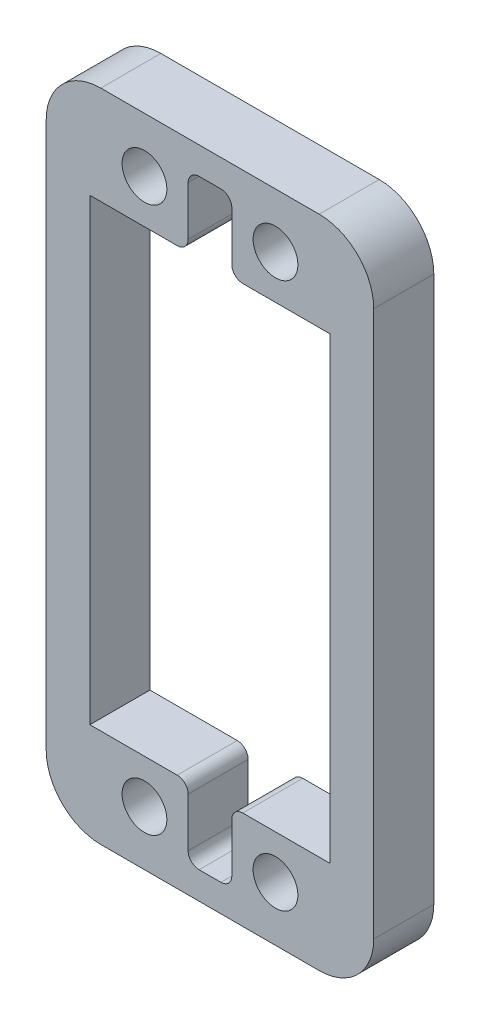
ISO-10303-21;
HEADER;
FILE_DESCRIPTION(('STEP AP214'),'2;1');
FILE_NAME('part.step','',(''),(''),'','','');
FILE_SCHEMA(('AUTOMOTIVE_DESIGN { 1 0 10303 214 1 1 1 1 }'));
ENDSEC;
DATA;
#1=APPLICATION_CONTEXT('core data for automotive mechanical design processes');
#2=APPLICATION_PROTOCOL_DEFINITION('international standard','automotive_design',2000,#1);
#3=PRODUCT_CONTEXT('',#1,'mechanical');
#4=PRODUCT('Part','Part','',(#3));
#5=PRODUCT_RELATED_PRODUCT_CATEGORY('part','',(#4));
#6=PRODUCT_DEFINITION_FORMATION('','',#4);
#7=PRODUCT_DEFINITION_CONTEXT('part definition',#1,'design');
#8=PRODUCT_DEFINITION('design','',#6,#7);
#9=PRODUCT_DEFINITION_SHAPE('','',#8);
#10=(LENGTH_UNIT() NAMED_UNIT(*) SI_UNIT(.MILLI.,.METRE.));
#11=(NAMED_UNIT(*) PLANE_ANGLE_UNIT() SI_UNIT($,.RADIAN.));
#12=(NAMED_UNIT(*) SI_UNIT($,.STERADIAN.) SOLID_ANGLE_UNIT());
#13=UNCERTAINTY_MEASURE_WITH_UNIT(LENGTH_MEASURE(1.E-05),#10,'distance_accuracy_value','');
#14=(GEOMETRIC_REPRESENTATION_CONTEXT(3) GLOBAL_UNCERTAINTY_ASSIGNED_CONTEXT((#13)) GLOBAL_UNIT_ASSIGNED_CONTEXT((#10,
#11,#12)) REPRESENTATION_CONTEXT('',''));
#15=CARTESIAN_POINT('',(0.,0.,0.));
#16=DIRECTION('',(0.,0.,1.));
#17=DIRECTION('',(1.,0.,0.));
#18=AXIS2_PLACEMENT_3D('',#15,#16,#17);
#19=CARTESIAN_POINT('',(11.,21.,5.5));
#20=DIRECTION('',(0.,1.,0.));
#21=DIRECTION('',(0.,0.,1.));
#22=AXIS2_PLACEMENT_3D('',#19,#20,#21);
#23=PLANE('',#22);
#24=DIRECTION('',(1.,0.,0.));
#25=VECTOR('',#24,1.);
#26=CARTESIAN_POINT('',(11.,21.,0.));
#27=LINE('',#26,#25);
#28=CARTESIAN_POINT('',(-11.,21.,0.));
#29=VERTEX_POINT('',#28);
#30=CARTESIAN_POINT('',(-3.,21.,0.));
#31=VERTEX_POINT('',#30);
#32=EDGE_CURVE('E251',#29,#31,#27,.T.);
#33=ORIENTED_EDGE('',*,*,#32,.T.);
#34=DIRECTION('',(0.,0.,1.));
#35=VECTOR('',#34,1.);
#36=CARTESIAN_POINT('',(-3.,21.,5.5));
#37=LINE('',#36,#35);
#38=CARTESIAN_POINT('',(-3.,21.,5.5));
#39=VERTEX_POINT('',#38);
#40=EDGE_CURVE('E387',#31,#39,#37,.T.);
#41=ORIENTED_EDGE('',*,*,#40,.T.);
#42=DIRECTION('',(1.,0.,0.));
#43=VECTOR('',#42,1.);
#44=CARTESIAN_POINT('',(11.,21.,5.5));
#45=LINE('',#44,#43);
#46=CARTESIAN_POINT('',(-11.,21.,5.5));
#47=VERTEX_POINT('',#46);
#48=EDGE_CURVE('E235',#47,#39,#45,.T.);
#49=ORIENTED_EDGE('',*,*,#48,.F.);
#50=DIRECTION('',(0.,0.,-1.));
#51=VECTOR('',#50,1.);
#52=CARTESIAN_POINT('',(-11.,21.,5.5));
#53=LINE('',#52,#51);
#54=EDGE_CURVE('E275',#47,#29,#53,.T.);
#55=ORIENTED_EDGE('',*,*,#54,.T.);
#56=EDGE_LOOP('',(#33,#41,#49,#55));
#57=FACE_BOUND('',#56,.T.);
#58=ADVANCED_FACE('F38',(#57),#23,.F.);
#59=CARTESIAN_POINT('',(-11.,-21.,5.5));
#60=DIRECTION('',(0.,-1.,0.));
#61=DIRECTION('',(0.,0.,-1.));
#62=AXIS2_PLACEMENT_3D('',#59,#60,#61);
#63=PLANE('',#62);
#64=DIRECTION('',(-1.,0.,0.));
#65=VECTOR('',#64,1.);
#66=CARTESIAN_POINT('',(-11.,-21.,5.5));
#67=LINE('',#66,#65);
#68=CARTESIAN_POINT('',(-3.00000000000001,-21.,5.5));
#69=VERTEX_POINT('',#68);
#70=CARTESIAN_POINT('',(-11.,-21.,5.5));
#71=VERTEX_POINT('',#70);
#72=EDGE_CURVE('E243',#69,#71,#67,.T.);
#73=ORIENTED_EDGE('',*,*,#72,.F.);
#74=DIRECTION('',(0.,0.,-1.));
#75=VECTOR('',#74,1.);
#76=CARTESIAN_POINT('',(-3.00000000000001,-21.,5.5));
#77=LINE('',#76,#75);
#78=CARTESIAN_POINT('',(-3.00000000000001,-21.,0.));
#79=VERTEX_POINT('',#78);
#80=EDGE_CURVE('E348',#69,#79,#77,.T.);
#81=ORIENTED_EDGE('',*,*,#80,.T.);
#82=DIRECTION('',(-1.,0.,0.));
#83=VECTOR('',#82,1.);
#84=CARTESIAN_POINT('',(-11.,-21.,0.));
#85=LINE('',#84,#83);
#86=CARTESIAN_POINT('',(-11.,-21.,0.));
#87=VERTEX_POINT('',#86);
#88=EDGE_CURVE('E265',#79,#87,#85,.T.);
#89=ORIENTED_EDGE('',*,*,#88,.T.);
#90=DIRECTION('',(0.,0.,-1.));
#91=VECTOR('',#90,1.);
#92=CARTESIAN_POINT('',(-11.,-21.,5.5));
#93=LINE('',#92,#91);
#94=EDGE_CURVE('E234',#71,#87,#93,.T.);
#95=ORIENTED_EDGE('',*,*,#94,.F.);
#96=EDGE_LOOP('',(#73,#81,#89,#95));
#97=FACE_BOUND('',#96,.T.);
#98=ADVANCED_FACE('F514',(#97),#63,.F.);
#99=CARTESIAN_POINT('',(-15.,-30.,5.5));
#100=DIRECTION('',(1.,0.,0.));
#101=DIRECTION('',(0.,0.,-1.));
#102=AXIS2_PLACEMENT_3D('',#99,#100,#101);
#103=PLANE('',#102);
#104=DIRECTION('',(0.,-1.,0.));
#105=VECTOR('',#104,1.);
#106=CARTESIAN_POINT('',(-15.,-30.,0.));
#107=LINE('',#106,#105);
#108=CARTESIAN_POINT('',(-15.,25.,0.));
#109=VERTEX_POINT('',#108);
#110=CARTESIAN_POINT('',(-15.,-25.,0.));
#111=VERTEX_POINT('',#110);
#112=EDGE_CURVE('E274',#109,#111,#107,.T.);
#113=ORIENTED_EDGE('',*,*,#112,.T.);
#114=DIRECTION('',(0.,0.,-1.));
#115=VECTOR('',#114,1.);
#116=CARTESIAN_POINT('',(-15.,-25.,5.5));
#117=LINE('',#116,#115);
#118=CARTESIAN_POINT('',(-15.,-25.,5.5));
#119=VERTEX_POINT('',#118);
#120=EDGE_CURVE('E318',#111,#119,#117,.F.);
#121=ORIENTED_EDGE('',*,*,#120,.T.);
#122=DIRECTION('',(0.,-1.,0.));
#123=VECTOR('',#122,1.);
#124=CARTESIAN_POINT('',(-15.,-30.,5.5));
#125=LINE('',#124,#123);
#126=CARTESIAN_POINT('',(-15.,25.,5.5));
#127=VERTEX_POINT('',#126);
#128=EDGE_CURVE('E279',#127,#119,#125,.T.);
#129=ORIENTED_EDGE('',*,*,#128,.F.);
#130=DIRECTION('',(0.,0.,-1.));
#131=VECTOR('',#130,1.);
#132=CARTESIAN_POINT('',(-15.,25.,5.5));
#133=LINE('',#132,#131);
#134=EDGE_CURVE('E315',#127,#109,#133,.T.);
#135=ORIENTED_EDGE('',*,*,#134,.T.);
#136=EDGE_LOOP('',(#113,#121,#129,#135));
#137=FACE_BOUND('',#136,.T.);
#138=ADVANCED_FACE('F496',(#137),#103,.F.);
#139=CARTESIAN_POINT('',(15.,-30.,5.5));
#140=DIRECTION('',(0.,1.,0.));
#141=DIRECTION('',(0.,0.,1.));
#142=AXIS2_PLACEMENT_3D('',#139,#140,#141);
#143=PLANE('',#142);
#144=DIRECTION('',(1.,0.,0.));
#145=VECTOR('',#144,1.);
#146=CARTESIAN_POINT('',(15.,-30.,5.5));
#147=LINE('',#146,#145);
#148=CARTESIAN_POINT('',(-10.,-30.,5.5));
#149=VERTEX_POINT('',#148);
#150=CARTESIAN_POINT('',(10.,-30.,5.5));
#151=VERTEX_POINT('',#150);
#152=EDGE_CURVE('E282',#149,#151,#147,.T.);
#153=ORIENTED_EDGE('',*,*,#152,.F.);
#154=DIRECTION('',(0.,0.,-1.));
#155=VECTOR('',#154,1.);
#156=CARTESIAN_POINT('',(-10.,-30.,5.5));
#157=LINE('',#156,#155);
#158=CARTESIAN_POINT('',(-10.,-30.,0.));
#159=VERTEX_POINT('',#158);
#160=EDGE_CURVE('E304',#149,#159,#157,.T.);
#161=ORIENTED_EDGE('',*,*,#160,.T.);
#162=DIRECTION('',(1.,0.,0.));
#163=VECTOR('',#162,1.);
#164=CARTESIAN_POINT('',(15.,-30.,0.));
#165=LINE('',#164,#163);
#166=CARTESIAN_POINT('',(10.,-30.,0.));
#167=VERTEX_POINT('',#166);
#168=EDGE_CURVE('E295',#159,#167,#165,.T.);
#169=ORIENTED_EDGE('',*,*,#168,.T.);
#170=DIRECTION('',(0.,0.,-1.));
#171=VECTOR('',#170,1.);
#172=CARTESIAN_POINT('',(10.,-30.,5.5));
#173=LINE('',#172,#171);
#174=EDGE_CURVE('E292',#167,#151,#173,.F.);
#175=ORIENTED_EDGE('',*,*,#174,.T.);
#176=EDGE_LOOP('',(#153,#161,#169,#175));
#177=FACE_BOUND('',#176,.T.);
#178=ADVANCED_FACE('F469',(#177),#143,.F.);
#179=CARTESIAN_POINT('',(15.,30.,5.5));
#180=DIRECTION('',(-1.,0.,0.));
#181=DIRECTION('',(0.,-1.,0.));
#182=AXIS2_PLACEMENT_3D('',#179,#180,#181);
#183=PLANE('',#182);
#184=DIRECTION('',(0.,1.,0.));
#185=VECTOR('',#184,1.);
#186=CARTESIAN_POINT('',(15.,30.,5.5));
#187=LINE('',#186,#185);
#188=CARTESIAN_POINT('',(15.,-25.,5.5));
#189=VERTEX_POINT('',#188);
#190=CARTESIAN_POINT('',(15.,25.,5.5));
#191=VERTEX_POINT('',#190);
#192=EDGE_CURVE('E286',#189,#191,#187,.T.);
#193=ORIENTED_EDGE('',*,*,#192,.F.);
#194=DIRECTION('',(0.,0.,-1.));
#195=VECTOR('',#194,1.);
#196=CARTESIAN_POINT('',(15.,-25.,5.5));
#197=LINE('',#196,#195);
#198=CARTESIAN_POINT('',(15.,-25.,0.));
#199=VERTEX_POINT('',#198);
#200=EDGE_CURVE('E330',#189,#199,#197,.T.);
#201=ORIENTED_EDGE('',*,*,#200,.T.);
#202=DIRECTION('',(0.,1.,0.));
#203=VECTOR('',#202,1.);
#204=CARTESIAN_POINT('',(15.,30.,0.));
#205=LINE('',#204,#203);
#206=CARTESIAN_POINT('',(15.,25.,0.));
#207=VERTEX_POINT('',#206);
#208=EDGE_CURVE('E298',#199,#207,#205,.T.);
#209=ORIENTED_EDGE('',*,*,#208,.T.);
#210=DIRECTION('',(0.,0.,-1.));
#211=VECTOR('',#210,1.);
#212=CARTESIAN_POINT('',(15.,25.,5.5));
#213=LINE('',#212,#211);
#214=EDGE_CURVE('E328',#207,#191,#213,.F.);
#215=ORIENTED_EDGE('',*,*,#214,.T.);
#216=EDGE_LOOP('',(#193,#201,#209,#215));
#217=FACE_BOUND('',#216,.T.);
#218=ADVANCED_FACE('F479',(#217),#183,.F.);
#219=CARTESIAN_POINT('',(-15.,30.,5.5));
#220=DIRECTION('',(0.,-1.,0.));
#221=DIRECTION('',(0.,0.,-1.));
#222=AXIS2_PLACEMENT_3D('',#219,#220,#221);
#223=PLANE('',#222);
#224=DIRECTION('',(-1.,0.,0.));
#225=VECTOR('',#224,1.);
#226=CARTESIAN_POINT('',(-15.,30.,5.5));
#227=LINE('',#226,#225);
#228=CARTESIAN_POINT('',(9.99999999999999,30.,5.5));
#229=VERTEX_POINT('',#228);
#230=CARTESIAN_POINT('',(-10.,30.,5.5));
#231=VERTEX_POINT('',#230);
#232=EDGE_CURVE('E289',#229,#231,#227,.T.);
#233=ORIENTED_EDGE('',*,*,#232,.F.);
#234=DIRECTION('',(0.,0.,-1.));
#235=VECTOR('',#234,1.);
#236=CARTESIAN_POINT('',(10.,30.,5.5));
#237=LINE('',#236,#235);
#238=CARTESIAN_POINT('',(9.99999999999999,30.,0.));
#239=VERTEX_POINT('',#238);
#240=EDGE_CURVE('E335',#229,#239,#237,.T.);
#241=ORIENTED_EDGE('',*,*,#240,.T.);
#242=DIRECTION('',(-1.,0.,0.));
#243=VECTOR('',#242,1.);
#244=CARTESIAN_POINT('',(-15.,30.,0.));
#245=LINE('',#244,#243);
#246=CARTESIAN_POINT('',(-10.,30.,0.));
#247=VERTEX_POINT('',#246);
#248=EDGE_CURVE('E283',#239,#247,#245,.T.);
#249=ORIENTED_EDGE('',*,*,#248,.T.);
#250=DIRECTION('',(0.,0.,-1.));
#251=VECTOR('',#250,1.);
#252=CARTESIAN_POINT('',(-10.,30.,5.5));
#253=LINE('',#252,#251);
#254=EDGE_CURVE('E333',#247,#231,#253,.F.);
#255=ORIENTED_EDGE('',*,*,#254,.T.);
#256=EDGE_LOOP('',(#233,#241,#249,#255));
#257=FACE_BOUND('',#256,.T.);
#258=ADVANCED_FACE('F487',(#257),#223,.F.);
#259=CARTESIAN_POINT('',(0.,0.,5.5));
#260=DIRECTION('',(0.,0.,-1.));
#261=DIRECTION('',(-1.,0.,0.));
#262=AXIS2_PLACEMENT_3D('',#259,#260,#261);
#263=PLANE('',#262);
#264=CARTESIAN_POINT('',(-6.,25.,5.5));
#265=DIRECTION('',(0.,0.,-1.));
#266=DIRECTION('',(-1.,0.,0.));
#267=AXIS2_PLACEMENT_3D('',#264,#265,#266);
#268=CIRCLE('',#267,2.05);
#269=CARTESIAN_POINT('',(-8.05,25.,5.5));
#270=VERTEX_POINT('',#269);
#271=EDGE_CURVE('E444',#270,#270,#268,.T.);
#272=ORIENTED_EDGE('',*,*,#271,.T.);
#273=EDGE_LOOP('',(#272));
#274=FACE_BOUND('',#273,.T.);
#275=CARTESIAN_POINT('',(6.,-25.,5.5));
#276=DIRECTION('',(0.,0.,-1.));
#277=DIRECTION('',(-1.,0.,0.));
#278=AXIS2_PLACEMENT_3D('',#275,#276,#277);
#279=CIRCLE('',#278,2.05);
#280=CARTESIAN_POINT('',(3.95,-25.,5.5));
#281=VERTEX_POINT('',#280);
#282=EDGE_CURVE('E450',#281,#281,#279,.T.);
#283=ORIENTED_EDGE('',*,*,#282,.T.);
#284=EDGE_LOOP('',(#283));
#285=FACE_BOUND('',#284,.T.);
#286=CARTESIAN_POINT('',(-6.,-25.,5.5));
#287=DIRECTION('',(0.,0.,-1.));
#288=DIRECTION('',(-1.,0.,0.));
#289=AXIS2_PLACEMENT_3D('',#286,#287,#288);
#290=CIRCLE('',#289,2.05);
#291=CARTESIAN_POINT('',(-8.05,-25.,5.5));
#292=VERTEX_POINT('',#291);
#293=EDGE_CURVE('E848',#292,#292,#290,.T.);
#294=ORIENTED_EDGE('',*,*,#293,.T.);
#295=EDGE_LOOP('',(#294));
#296=FACE_BOUND('',#295,.T.);
#297=DIRECTION('',(0.,1.,0.));
#298=VECTOR('',#297,1.);
#299=CARTESIAN_POINT('',(-2.,27.5,5.5));
#300=LINE('',#299,#298);
#301=CARTESIAN_POINT('',(-2.00000000000001,-26.5,5.5));
#302=VERTEX_POINT('',#301);
#303=CARTESIAN_POINT('',(-2.00000000000001,-22.,5.5));
#304=VERTEX_POINT('',#303);
#305=EDGE_CURVE('E434',#302,#304,#300,.T.);
#306=ORIENTED_EDGE('',*,*,#305,.T.);
#307=CARTESIAN_POINT('',(-3.00000000000001,-22.,5.5));
#308=DIRECTION('',(0.,0.,-1.));
#309=DIRECTION('',(-1.,0.,0.));
#310=AXIS2_PLACEMENT_3D('',#307,#308,#309);
#311=CIRCLE('',#310,1.);
#312=EDGE_CURVE('E364',#304,#69,#311,.F.);
#313=ORIENTED_EDGE('',*,*,#312,.T.);
#314=ORIENTED_EDGE('',*,*,#72,.T.);
#315=DIRECTION('',(0.,1.,0.));
#316=VECTOR('',#315,1.);
#317=CARTESIAN_POINT('',(-11.,21.,5.5));
#318=LINE('',#317,#316);
#319=EDGE_CURVE('E242',#71,#47,#318,.T.);
#320=ORIENTED_EDGE('',*,*,#319,.T.);
#321=ORIENTED_EDGE('',*,*,#48,.T.);
#322=CARTESIAN_POINT('',(-3.,22.,5.5));
#323=DIRECTION('',(0.,0.,-1.));
#324=DIRECTION('',(-1.,0.,0.));
#325=AXIS2_PLACEMENT_3D('',#322,#323,#324);
#326=CIRCLE('',#325,1.);
#327=CARTESIAN_POINT('',(-2.,22.,5.5));
#328=VERTEX_POINT('',#327);
#329=EDGE_CURVE('E359',#39,#328,#326,.F.);
#330=ORIENTED_EDGE('',*,*,#329,.T.);
#331=CARTESIAN_POINT('',(-2.,26.5,5.5));
#332=VERTEX_POINT('',#331);
#333=EDGE_CURVE('E428',#328,#332,#300,.T.);
#334=ORIENTED_EDGE('',*,*,#333,.T.);
#335=CARTESIAN_POINT('',(-1.,26.5,5.5));
#336=DIRECTION('',(0.,0.,-1.));
#337=DIRECTION('',(-1.,0.,0.));
#338=AXIS2_PLACEMENT_3D('',#335,#336,#337);
#339=CIRCLE('',#338,1.);
#340=CARTESIAN_POINT('',(-1.,27.5,5.5));
#341=VERTEX_POINT('',#340);
#342=EDGE_CURVE('E11',#332,#341,#339,.T.);
#343=ORIENTED_EDGE('',*,*,#342,.T.);
#344=DIRECTION('',(1.,0.,0.));
#345=VECTOR('',#344,1.);
#346=CARTESIAN_POINT('',(2.,27.5,5.5));
#347=LINE('',#346,#345);
#348=CARTESIAN_POINT('',(1.,27.5,5.5));
#349=VERTEX_POINT('',#348);
#350=EDGE_CURVE('E426',#341,#349,#347,.T.);
#351=ORIENTED_EDGE('',*,*,#350,.T.);
#352=CARTESIAN_POINT('',(1.,26.5,5.5));
#353=DIRECTION('',(0.,0.,-1.));
#354=DIRECTION('',(-1.,0.,0.));
#355=AXIS2_PLACEMENT_3D('',#352,#353,#354);
#356=CIRCLE('',#355,1.);
#357=CARTESIAN_POINT('',(2.,26.5,5.5));
#358=VERTEX_POINT('',#357);
#359=EDGE_CURVE('E400',#349,#358,#356,.T.);
#360=ORIENTED_EDGE('',*,*,#359,.T.);
#361=DIRECTION('',(0.,-1.,0.));
#362=VECTOR('',#361,1.);
#363=CARTESIAN_POINT('',(2.,21.,5.5));
#364=LINE('',#363,#362);
#365=CARTESIAN_POINT('',(2.,22.,5.5));
#366=VERTEX_POINT('',#365);
#367=EDGE_CURVE('E432',#358,#366,#364,.T.);
#368=ORIENTED_EDGE('',*,*,#367,.T.);
#369=CARTESIAN_POINT('',(3.,22.,5.5));
#370=DIRECTION('',(0.,0.,-1.));
#371=DIRECTION('',(-1.,0.,0.));
#372=AXIS2_PLACEMENT_3D('',#369,#370,#371);
#373=CIRCLE('',#372,1.);
#374=CARTESIAN_POINT('',(3.,21.,5.5));
#375=VERTEX_POINT('',#374);
#376=EDGE_CURVE('E361',#366,#375,#373,.F.);
#377=ORIENTED_EDGE('',*,*,#376,.T.);
#378=CARTESIAN_POINT('',(11.,21.,5.5));
#379=VERTEX_POINT('',#378);
#380=EDGE_CURVE('E249',#375,#379,#45,.T.);
#381=ORIENTED_EDGE('',*,*,#380,.T.);
#382=DIRECTION('',(0.,-1.,0.));
#383=VECTOR('',#382,1.);
#384=CARTESIAN_POINT('',(11.,-21.,5.5));
#385=LINE('',#384,#383);
#386=CARTESIAN_POINT('',(11.,-21.,5.5));
#387=VERTEX_POINT('',#386);
#388=EDGE_CURVE('E228',#379,#387,#385,.T.);
#389=ORIENTED_EDGE('',*,*,#388,.T.);
#390=CARTESIAN_POINT('',(2.99999999999999,-21.,5.5));
#391=VERTEX_POINT('',#390);
#392=EDGE_CURVE('E238',#387,#391,#67,.T.);
#393=ORIENTED_EDGE('',*,*,#392,.T.);
#394=CARTESIAN_POINT('',(2.99999999999999,-22.,5.5));
#395=DIRECTION('',(0.,0.,-1.));
#396=DIRECTION('',(-1.,0.,0.));
#397=AXIS2_PLACEMENT_3D('',#394,#395,#396);
#398=CIRCLE('',#397,1.);
#399=CARTESIAN_POINT('',(2.,-22.,5.5));
#400=VERTEX_POINT('',#399);
#401=EDGE_CURVE('E60',#391,#400,#398,.F.);
#402=ORIENTED_EDGE('',*,*,#401,.T.);
#403=CARTESIAN_POINT('',(2.,-26.5,5.5));
#404=VERTEX_POINT('',#403);
#405=EDGE_CURVE('E437',#400,#404,#364,.T.);
#406=ORIENTED_EDGE('',*,*,#405,.T.);
#407=CARTESIAN_POINT('',(0.999999999999993,-26.5,5.5));
#408=DIRECTION('',(0.,0.,-1.));
#409=DIRECTION('',(-1.,0.,0.));
#410=AXIS2_PLACEMENT_3D('',#407,#408,#409);
#411=CIRCLE('',#410,1.);
#412=CARTESIAN_POINT('',(0.999999999999993,-27.5,5.5));
#413=VERTEX_POINT('',#412);
#414=EDGE_CURVE('E396',#404,#413,#411,.T.);
#415=ORIENTED_EDGE('',*,*,#414,.T.);
#416=DIRECTION('',(-1.,0.,0.));
#417=VECTOR('',#416,1.);
#418=CARTESIAN_POINT('',(-2.00000000000001,-27.5,5.5));
#419=LINE('',#418,#417);
#420=CARTESIAN_POINT('',(-1.00000000000001,-27.5,5.5));
#421=VERTEX_POINT('',#420);
#422=EDGE_CURVE('E555',#413,#421,#419,.T.);
#423=ORIENTED_EDGE('',*,*,#422,.T.);
#424=CARTESIAN_POINT('',(-1.00000000000001,-26.5,5.5));
#425=DIRECTION('',(0.,0.,-1.));
#426=DIRECTION('',(-1.,0.,0.));
#427=AXIS2_PLACEMENT_3D('',#424,#425,#426);
#428=CIRCLE('',#427,1.);
#429=EDGE_CURVE('E392',#421,#302,#428,.T.);
#430=ORIENTED_EDGE('',*,*,#429,.T.);
#431=EDGE_LOOP('',(#306,#313,#314,#320,#321,#330,#334,#343,#351,#360,#368,#377,#381,#389,#393,
#402,#406,#415,#423,#430));
#432=FACE_BOUND('',#431,.T.);
#433=CARTESIAN_POINT('',(6.,25.,5.5));
#434=DIRECTION('',(0.,0.,-1.));
#435=DIRECTION('',(-1.,0.,0.));
#436=AXIS2_PLACEMENT_3D('',#433,#434,#435);
#437=CIRCLE('',#436,2.05);
#438=CARTESIAN_POINT('',(3.95,25.,5.5));
#439=VERTEX_POINT('',#438);
#440=EDGE_CURVE('E266',#439,#439,#437,.T.);
#441=ORIENTED_EDGE('',*,*,#440,.T.);
#442=EDGE_LOOP('',(#441));
#443=FACE_BOUND('',#442,.T.);
#444=ORIENTED_EDGE('',*,*,#128,.T.);
#445=CARTESIAN_POINT('',(-10.,-25.,5.5));
#446=DIRECTION('',(0.,0.,-1.));
#447=DIRECTION('',(-1.,0.,0.));
#448=AXIS2_PLACEMENT_3D('',#445,#446,#447);
#449=CIRCLE('',#448,5.);
#450=EDGE_CURVE('E326',#119,#149,#449,.F.);
#451=ORIENTED_EDGE('',*,*,#450,.T.);
#452=ORIENTED_EDGE('',*,*,#152,.T.);
#453=CARTESIAN_POINT('',(10.,-25.,5.5));
#454=DIRECTION('',(0.,0.,-1.));
#455=DIRECTION('',(-1.,0.,0.));
#456=AXIS2_PLACEMENT_3D('',#453,#454,#455);
#457=CIRCLE('',#456,5.);
#458=EDGE_CURVE('E324',#151,#189,#457,.F.);
#459=ORIENTED_EDGE('',*,*,#458,.T.);
#460=ORIENTED_EDGE('',*,*,#192,.T.);
#461=CARTESIAN_POINT('',(10.,25.,5.5));
#462=DIRECTION('',(0.,0.,-1.));
#463=DIRECTION('',(-1.,0.,0.));
#464=AXIS2_PLACEMENT_3D('',#461,#462,#463);
#465=CIRCLE('',#464,5.);
#466=EDGE_CURVE('E322',#191,#229,#465,.F.);
#467=ORIENTED_EDGE('',*,*,#466,.T.);
#468=ORIENTED_EDGE('',*,*,#232,.T.);
#469=CARTESIAN_POINT('',(-10.,25.,5.5));
#470=DIRECTION('',(0.,0.,-1.));
#471=DIRECTION('',(-1.,0.,0.));
#472=AXIS2_PLACEMENT_3D('',#469,#470,#471);
#473=CIRCLE('',#472,5.);
#474=EDGE_CURVE('E320',#231,#127,#473,.F.);
#475=ORIENTED_EDGE('',*,*,#474,.T.);
#476=EDGE_LOOP('',(#444,#451,#452,#459,#460,#467,#468,#475));
#477=FACE_BOUND('',#476,.T.);
#478=ADVANCED_FACE('F246',(#274,#285,#296,#432,#443,#477),#263,.F.);
#479=CARTESIAN_POINT('',(0.,0.,0.));
#480=DIRECTION('',(0.,0.,-1.));
#481=DIRECTION('',(-1.,0.,0.));
#482=AXIS2_PLACEMENT_3D('',#479,#480,#481);
#483=PLANE('',#482);
#484=CARTESIAN_POINT('',(-6.,25.,0.));
#485=DIRECTION('',(0.,0.,-1.));
#486=DIRECTION('',(-1.,0.,0.));
#487=AXIS2_PLACEMENT_3D('',#484,#485,#486);
#488=CIRCLE('',#487,2.05);
#489=CARTESIAN_POINT('',(-8.05,25.,0.));
#490=VERTEX_POINT('',#489);
#491=EDGE_CURVE('E441',#490,#490,#488,.T.);
#492=ORIENTED_EDGE('',*,*,#491,.F.);
#493=EDGE_LOOP('',(#492));
#494=FACE_BOUND('',#493,.T.);
#495=CARTESIAN_POINT('',(6.,-25.,0.));
#496=DIRECTION('',(0.,0.,-1.));
#497=DIRECTION('',(-1.,0.,0.));
#498=AXIS2_PLACEMENT_3D('',#495,#496,#497);
#499=CIRCLE('',#498,2.05);
#500=CARTESIAN_POINT('',(3.95,-25.,0.));
#501=VERTEX_POINT('',#500);
#502=EDGE_CURVE('E447',#501,#501,#499,.T.);
#503=ORIENTED_EDGE('',*,*,#502,.F.);
#504=EDGE_LOOP('',(#503));
#505=FACE_BOUND('',#504,.T.);
#506=CARTESIAN_POINT('',(-6.,-25.,0.));
#507=DIRECTION('',(0.,0.,-1.));
#508=DIRECTION('',(-1.,0.,0.));
#509=AXIS2_PLACEMENT_3D('',#506,#507,#508);
#510=CIRCLE('',#509,2.05);
#511=CARTESIAN_POINT('',(-8.05,-25.,0.));
#512=VERTEX_POINT('',#511);
#513=EDGE_CURVE('E452',#512,#512,#510,.T.);
#514=ORIENTED_EDGE('',*,*,#513,.F.);
#515=EDGE_LOOP('',(#514));
#516=FACE_BOUND('',#515,.T.);
#517=ORIENTED_EDGE('',*,*,#88,.F.);
#518=CARTESIAN_POINT('',(-3.00000000000001,-22.,0.));
#519=DIRECTION('',(0.,0.,-1.));
#520=DIRECTION('',(-1.,0.,0.));
#521=AXIS2_PLACEMENT_3D('',#518,#519,#520);
#522=CIRCLE('',#521,1.);
#523=CARTESIAN_POINT('',(-2.00000000000001,-22.,0.));
#524=VERTEX_POINT('',#523);
#525=EDGE_CURVE('E357',#79,#524,#522,.T.);
#526=ORIENTED_EDGE('',*,*,#525,.T.);
#527=DIRECTION('',(0.,1.,0.));
#528=VECTOR('',#527,1.);
#529=CARTESIAN_POINT('',(-2.,27.5,0.));
#530=LINE('',#529,#528);
#531=CARTESIAN_POINT('',(-2.00000000000001,-26.5,0.));
#532=VERTEX_POINT('',#531);
#533=EDGE_CURVE('E420',#532,#524,#530,.T.);
#534=ORIENTED_EDGE('',*,*,#533,.F.);
#535=CARTESIAN_POINT('',(-1.00000000000001,-26.5,0.));
#536=DIRECTION('',(0.,0.,-1.));
#537=DIRECTION('',(-1.,0.,0.));
#538=AXIS2_PLACEMENT_3D('',#535,#536,#537);
#539=CIRCLE('',#538,1.);
#540=CARTESIAN_POINT('',(-1.00000000000001,-27.5,0.));
#541=VERTEX_POINT('',#540);
#542=EDGE_CURVE('E390',#532,#541,#539,.F.);
#543=ORIENTED_EDGE('',*,*,#542,.T.);
#544=DIRECTION('',(-1.,0.,0.));
#545=VECTOR('',#544,1.);
#546=CARTESIAN_POINT('',(-2.00000000000001,-27.5,0.));
#547=LINE('',#546,#545);
#548=CARTESIAN_POINT('',(0.999999999999993,-27.5,0.));
#549=VERTEX_POINT('',#548);
#550=EDGE_CURVE('E552',#549,#541,#547,.T.);
#551=ORIENTED_EDGE('',*,*,#550,.F.);
#552=CARTESIAN_POINT('',(0.999999999999993,-26.5,0.));
#553=DIRECTION('',(0.,0.,-1.));
#554=DIRECTION('',(-1.,0.,0.));
#555=AXIS2_PLACEMENT_3D('',#552,#553,#554);
#556=CIRCLE('',#555,1.);
#557=CARTESIAN_POINT('',(1.99999999999999,-26.5,0.));
#558=VERTEX_POINT('',#557);
#559=EDGE_CURVE('E394',#549,#558,#556,.F.);
#560=ORIENTED_EDGE('',*,*,#559,.T.);
#561=DIRECTION('',(0.,-1.,0.));
#562=VECTOR('',#561,1.);
#563=CARTESIAN_POINT('',(1.99999999999999,-27.5,0.));
#564=LINE('',#563,#562);
#565=CARTESIAN_POINT('',(1.99999999999999,-22.,0.));
#566=VERTEX_POINT('',#565);
#567=EDGE_CURVE('E549',#566,#558,#564,.T.);
#568=ORIENTED_EDGE('',*,*,#567,.F.);
#569=CARTESIAN_POINT('',(2.99999999999999,-22.,0.));
#570=DIRECTION('',(0.,0.,-1.));
#571=DIRECTION('',(-1.,0.,0.));
#572=AXIS2_PLACEMENT_3D('',#569,#570,#571);
#573=CIRCLE('',#572,1.);
#574=CARTESIAN_POINT('',(2.99999999999999,-21.,0.));
#575=VERTEX_POINT('',#574);
#576=EDGE_CURVE('E355',#566,#575,#573,.T.);
#577=ORIENTED_EDGE('',*,*,#576,.T.);
#578=CARTESIAN_POINT('',(11.,-21.,0.));
#579=VERTEX_POINT('',#578);
#580=EDGE_CURVE('E267',#579,#575,#85,.T.);
#581=ORIENTED_EDGE('',*,*,#580,.F.);
#582=DIRECTION('',(0.,-1.,0.));
#583=VECTOR('',#582,1.);
#584=CARTESIAN_POINT('',(11.,-21.,0.));
#585=LINE('',#584,#583);
#586=CARTESIAN_POINT('',(11.,21.,0.));
#587=VERTEX_POINT('',#586);
#588=EDGE_CURVE('E230',#587,#579,#585,.T.);
#589=ORIENTED_EDGE('',*,*,#588,.F.);
#590=CARTESIAN_POINT('',(3.,21.,0.));
#591=VERTEX_POINT('',#590);
#592=EDGE_CURVE('E254',#591,#587,#27,.T.);
#593=ORIENTED_EDGE('',*,*,#592,.F.);
#594=CARTESIAN_POINT('',(3.,22.,0.));
#595=DIRECTION('',(0.,0.,-1.));
#596=DIRECTION('',(-1.,0.,0.));
#597=AXIS2_PLACEMENT_3D('',#594,#595,#596);
#598=CIRCLE('',#597,1.);
#599=CARTESIAN_POINT('',(2.,22.,0.));
#600=VERTEX_POINT('',#599);
#601=EDGE_CURVE('E353',#591,#600,#598,.T.);
#602=ORIENTED_EDGE('',*,*,#601,.T.);
#603=CARTESIAN_POINT('',(2.,26.5,0.));
#604=VERTEX_POINT('',#603);
#605=EDGE_CURVE('E544',#604,#600,#564,.T.);
#606=ORIENTED_EDGE('',*,*,#605,.F.);
#607=CARTESIAN_POINT('',(1.,26.5,0.));
#608=DIRECTION('',(0.,0.,-1.));
#609=DIRECTION('',(-1.,0.,0.));
#610=AXIS2_PLACEMENT_3D('',#607,#608,#609);
#611=CIRCLE('',#610,1.);
#612=CARTESIAN_POINT('',(1.,27.5,0.));
#613=VERTEX_POINT('',#612);
#614=EDGE_CURVE('E398',#604,#613,#611,.F.);
#615=ORIENTED_EDGE('',*,*,#614,.T.);
#616=DIRECTION('',(1.,0.,0.));
#617=VECTOR('',#616,1.);
#618=CARTESIAN_POINT('',(2.,27.5,0.));
#619=LINE('',#618,#617);
#620=CARTESIAN_POINT('',(-1.,27.5,0.));
#621=VERTEX_POINT('',#620);
#622=EDGE_CURVE('E411',#621,#613,#619,.T.);
#623=ORIENTED_EDGE('',*,*,#622,.F.);
#624=CARTESIAN_POINT('',(-1.,26.5,0.));
#625=DIRECTION('',(0.,0.,-1.));
#626=DIRECTION('',(-1.,0.,0.));
#627=AXIS2_PLACEMENT_3D('',#624,#625,#626);
#628=CIRCLE('',#627,1.);
#629=CARTESIAN_POINT('',(-2.,26.5,0.));
#630=VERTEX_POINT('',#629);
#631=EDGE_CURVE('E46',#621,#630,#628,.F.);
#632=ORIENTED_EDGE('',*,*,#631,.T.);
#633=CARTESIAN_POINT('',(-2.,22.,0.));
#634=VERTEX_POINT('',#633);
#635=EDGE_CURVE('E408',#634,#630,#530,.T.);
#636=ORIENTED_EDGE('',*,*,#635,.F.);
#637=CARTESIAN_POINT('',(-3.,22.,0.));
#638=DIRECTION('',(0.,0.,-1.));
#639=DIRECTION('',(-1.,0.,0.));
#640=AXIS2_PLACEMENT_3D('',#637,#638,#639);
#641=CIRCLE('',#640,1.);
#642=EDGE_CURVE('E351',#634,#31,#641,.T.);
#643=ORIENTED_EDGE('',*,*,#642,.T.);
#644=ORIENTED_EDGE('',*,*,#32,.F.);
#645=DIRECTION('',(0.,1.,0.));
#646=VECTOR('',#645,1.);
#647=CARTESIAN_POINT('',(-11.,21.,0.));
#648=LINE('',#647,#646);
#649=EDGE_CURVE('E269',#87,#29,#648,.T.);
#650=ORIENTED_EDGE('',*,*,#649,.F.);
#651=EDGE_LOOP('',(#517,#526,#534,#543,#551,#560,#568,#577,#581,#589,#593,#602,#606,#615,#623,
#632,#636,#643,#644,#650));
#652=FACE_BOUND('',#651,.T.);
#653=CARTESIAN_POINT('',(6.,25.,0.));
#654=DIRECTION('',(0.,0.,-1.));
#655=DIRECTION('',(-1.,0.,0.));
#656=AXIS2_PLACEMENT_3D('',#653,#654,#655);
#657=CIRCLE('',#656,2.05);
#658=CARTESIAN_POINT('',(3.95,25.,0.));
#659=VERTEX_POINT('',#658);
#660=EDGE_CURVE('E257',#659,#659,#657,.T.);
#661=ORIENTED_EDGE('',*,*,#660,.F.);
#662=EDGE_LOOP('',(#661));
#663=FACE_BOUND('',#662,.T.);
#664=ORIENTED_EDGE('',*,*,#168,.F.);
#665=CARTESIAN_POINT('',(-10.,-25.,0.));
#666=DIRECTION('',(0.,0.,-1.));
#667=DIRECTION('',(-1.,0.,0.));
#668=AXIS2_PLACEMENT_3D('',#665,#666,#667);
#669=CIRCLE('',#668,5.);
#670=EDGE_CURVE('E313',#159,#111,#669,.T.);
#671=ORIENTED_EDGE('',*,*,#670,.T.);
#672=ORIENTED_EDGE('',*,*,#112,.F.);
#673=CARTESIAN_POINT('',(-10.,25.,0.));
#674=DIRECTION('',(0.,0.,-1.));
#675=DIRECTION('',(-1.,0.,0.));
#676=AXIS2_PLACEMENT_3D('',#673,#674,#675);
#677=CIRCLE('',#676,5.);
#678=EDGE_CURVE('E307',#109,#247,#677,.T.);
#679=ORIENTED_EDGE('',*,*,#678,.T.);
#680=ORIENTED_EDGE('',*,*,#248,.F.);
#681=CARTESIAN_POINT('',(10.,25.,0.));
#682=DIRECTION('',(0.,0.,-1.));
#683=DIRECTION('',(-1.,0.,0.));
#684=AXIS2_PLACEMENT_3D('',#681,#682,#683);
#685=CIRCLE('',#684,5.);
#686=EDGE_CURVE('E309',#239,#207,#685,.T.);
#687=ORIENTED_EDGE('',*,*,#686,.T.);
#688=ORIENTED_EDGE('',*,*,#208,.F.);
#689=CARTESIAN_POINT('',(10.,-25.,0.));
#690=DIRECTION('',(0.,0.,-1.));
#691=DIRECTION('',(-1.,0.,0.));
#692=AXIS2_PLACEMENT_3D('',#689,#690,#691);
#693=CIRCLE('',#692,5.);
#694=EDGE_CURVE('E311',#199,#167,#693,.T.);
#695=ORIENTED_EDGE('',*,*,#694,.T.);
#696=EDGE_LOOP('',(#664,#671,#672,#679,#680,#687,#688,#695));
#697=FACE_BOUND('',#696,.T.);
#698=ADVANCED_FACE('F406',(#494,#505,#516,#652,#663,#697),#483,.T.);
#699=CARTESIAN_POINT('',(11.,-21.,5.5));
#700=DIRECTION('',(1.,0.,0.));
#701=DIRECTION('',(0.,0.,-1.));
#702=AXIS2_PLACEMENT_3D('',#699,#700,#701);
#703=PLANE('',#702);
#704=ORIENTED_EDGE('',*,*,#588,.T.);
#705=DIRECTION('',(0.,0.,-1.));
#706=VECTOR('',#705,1.);
#707=CARTESIAN_POINT('',(11.,-21.,5.5));
#708=LINE('',#707,#706);
#709=EDGE_CURVE('E223',#387,#579,#708,.T.);
#710=ORIENTED_EDGE('',*,*,#709,.F.);
#711=ORIENTED_EDGE('',*,*,#388,.F.);
#712=DIRECTION('',(0.,0.,-1.));
#713=VECTOR('',#712,1.);
#714=CARTESIAN_POINT('',(11.,21.,5.5));
#715=LINE('',#714,#713);
#716=EDGE_CURVE('E272',#379,#587,#715,.T.);
#717=ORIENTED_EDGE('',*,*,#716,.T.);
#718=EDGE_LOOP('',(#704,#710,#711,#717));
#719=FACE_BOUND('',#718,.T.);
#720=ADVANCED_FACE('F225',(#719),#703,.F.);
#721=ORIENTED_EDGE('',*,*,#380,.F.);
#722=DIRECTION('',(0.,0.,-1.));
#723=VECTOR('',#722,1.);
#724=CARTESIAN_POINT('',(3.,21.,5.5));
#725=LINE('',#724,#723);
#726=EDGE_CURVE('E384',#375,#591,#725,.T.);
#727=ORIENTED_EDGE('',*,*,#726,.T.);
#728=ORIENTED_EDGE('',*,*,#592,.T.);
#729=ORIENTED_EDGE('',*,*,#716,.F.);
#730=EDGE_LOOP('',(#721,#727,#728,#729));
#731=FACE_BOUND('',#730,.T.);
#732=ADVANCED_FACE('F517',(#731),#23,.F.);
#733=CARTESIAN_POINT('',(-11.,21.,5.5));
#734=DIRECTION('',(-1.,0.,0.));
#735=DIRECTION('',(0.,0.,1.));
#736=AXIS2_PLACEMENT_3D('',#733,#734,#735);
#737=PLANE('',#736);
#738=ORIENTED_EDGE('',*,*,#649,.T.);
#739=ORIENTED_EDGE('',*,*,#54,.F.);
#740=ORIENTED_EDGE('',*,*,#319,.F.);
#741=ORIENTED_EDGE('',*,*,#94,.T.);
#742=EDGE_LOOP('',(#738,#739,#740,#741));
#743=FACE_BOUND('',#742,.T.);
#744=ADVANCED_FACE('F527',(#743),#737,.F.);
#745=ORIENTED_EDGE('',*,*,#580,.T.);
#746=DIRECTION('',(0.,0.,1.));
#747=VECTOR('',#746,1.);
#748=CARTESIAN_POINT('',(2.99999999999999,-21.,5.5));
#749=LINE('',#748,#747);
#750=EDGE_CURVE('E241',#575,#391,#749,.T.);
#751=ORIENTED_EDGE('',*,*,#750,.T.);
#752=ORIENTED_EDGE('',*,*,#392,.F.);
#753=ORIENTED_EDGE('',*,*,#709,.T.);
#754=EDGE_LOOP('',(#745,#751,#752,#753));
#755=FACE_BOUND('',#754,.T.);
#756=ADVANCED_FACE('F239',(#755),#63,.F.);
#757=CARTESIAN_POINT('',(-2.,27.5,5.5));
#758=DIRECTION('',(-1.,0.,0.));
#759=DIRECTION('',(0.,-1.,0.));
#760=AXIS2_PLACEMENT_3D('',#757,#758,#759);
#761=PLANE('',#760);
#762=ORIENTED_EDGE('',*,*,#305,.F.);
#763=DIRECTION('',(0.,0.,-1.));
#764=VECTOR('',#763,1.);
#765=CARTESIAN_POINT('',(-2.00000000000001,-26.5,0.));
#766=LINE('',#765,#764);
#767=EDGE_CURVE('E340',#302,#532,#766,.T.);
#768=ORIENTED_EDGE('',*,*,#767,.T.);
#769=ORIENTED_EDGE('',*,*,#533,.T.);
#770=DIRECTION('',(0.,0.,-1.));
#771=VECTOR('',#770,1.);
#772=CARTESIAN_POINT('',(-2.00000000000001,-22.,5.5));
#773=LINE('',#772,#771);
#774=EDGE_CURVE('E338',#524,#304,#773,.F.);
#775=ORIENTED_EDGE('',*,*,#774,.T.);
#776=EDGE_LOOP('',(#762,#768,#769,#775));
#777=FACE_BOUND('',#776,.T.);
#778=ADVANCED_FACE('F693',(#777),#761,.F.);
#779=CARTESIAN_POINT('',(1.99999999999999,-27.5,5.5));
#780=DIRECTION('',(1.,0.,0.));
#781=DIRECTION('',(0.,1.,0.));
#782=AXIS2_PLACEMENT_3D('',#779,#780,#781);
#783=PLANE('',#782);
#784=ORIENTED_EDGE('',*,*,#405,.F.);
#785=DIRECTION('',(0.,0.,1.));
#786=VECTOR('',#785,1.);
#787=CARTESIAN_POINT('',(1.99999999999999,-22.,5.5));
#788=LINE('',#787,#786);
#789=EDGE_CURVE('E368',#400,#566,#788,.F.);
#790=ORIENTED_EDGE('',*,*,#789,.T.);
#791=ORIENTED_EDGE('',*,*,#567,.T.);
#792=DIRECTION('',(0.,0.,-1.));
#793=VECTOR('',#792,1.);
#794=CARTESIAN_POINT('',(1.99999999999999,-26.5,5.5));
#795=LINE('',#794,#793);
#796=EDGE_CURVE('E53',#558,#404,#795,.F.);
#797=ORIENTED_EDGE('',*,*,#796,.T.);
#798=EDGE_LOOP('',(#784,#790,#791,#797));
#799=FACE_BOUND('',#798,.T.);
#800=ADVANCED_FACE('F685',(#799),#783,.F.);
#801=CARTESIAN_POINT('',(-2.00000000000001,-27.5,5.5));
#802=DIRECTION('',(0.,-1.,0.));
#803=DIRECTION('',(0.,0.,-1.));
#804=AXIS2_PLACEMENT_3D('',#801,#802,#803);
#805=PLANE('',#804);
#806=ORIENTED_EDGE('',*,*,#550,.T.);
#807=DIRECTION('',(0.,0.,-1.));
#808=VECTOR('',#807,1.);
#809=CARTESIAN_POINT('',(-1.00000000000001,-27.5,5.5));
#810=LINE('',#809,#808);
#811=EDGE_CURVE('E346',#541,#421,#810,.F.);
#812=ORIENTED_EDGE('',*,*,#811,.T.);
#813=ORIENTED_EDGE('',*,*,#422,.F.);
#814=DIRECTION('',(0.,0.,-1.));
#815=VECTOR('',#814,1.);
#816=CARTESIAN_POINT('',(0.999999999999993,-27.5,0.));
#817=LINE('',#816,#815);
#818=EDGE_CURVE('E343',#413,#549,#817,.T.);
#819=ORIENTED_EDGE('',*,*,#818,.T.);
#820=EDGE_LOOP('',(#806,#812,#813,#819));
#821=FACE_BOUND('',#820,.T.);
#822=ADVANCED_FACE('F567',(#821),#805,.F.);
#823=ORIENTED_EDGE('',*,*,#635,.T.);
#824=DIRECTION('',(0.,0.,-1.));
#825=VECTOR('',#824,1.);
#826=CARTESIAN_POINT('',(-2.,26.5,5.5));
#827=LINE('',#826,#825);
#828=EDGE_CURVE('E382',#630,#332,#827,.F.);
#829=ORIENTED_EDGE('',*,*,#828,.T.);
#830=ORIENTED_EDGE('',*,*,#333,.F.);
#831=DIRECTION('',(0.,0.,1.));
#832=VECTOR('',#831,1.);
#833=CARTESIAN_POINT('',(-2.,22.,5.5));
#834=LINE('',#833,#832);
#835=EDGE_CURVE('E380',#328,#634,#834,.F.);
#836=ORIENTED_EDGE('',*,*,#835,.T.);
#837=EDGE_LOOP('',(#823,#829,#830,#836));
#838=FACE_BOUND('',#837,.T.);
#839=ADVANCED_FACE('F416',(#838),#761,.F.);
#840=ORIENTED_EDGE('',*,*,#367,.F.);
#841=DIRECTION('',(0.,0.,-1.));
#842=VECTOR('',#841,1.);
#843=CARTESIAN_POINT('',(2.,26.5,0.));
#844=LINE('',#843,#842);
#845=EDGE_CURVE('E372',#358,#604,#844,.T.);
#846=ORIENTED_EDGE('',*,*,#845,.T.);
#847=ORIENTED_EDGE('',*,*,#605,.T.);
#848=DIRECTION('',(0.,0.,-1.));
#849=VECTOR('',#848,1.);
#850=CARTESIAN_POINT('',(2.,22.,5.5));
#851=LINE('',#850,#849);
#852=EDGE_CURVE('E370',#600,#366,#851,.F.);
#853=ORIENTED_EDGE('',*,*,#852,.T.);
#854=EDGE_LOOP('',(#840,#846,#847,#853));
#855=FACE_BOUND('',#854,.T.);
#856=ADVANCED_FACE('F547',(#855),#783,.F.);
#857=CARTESIAN_POINT('',(2.,27.5,5.5));
#858=DIRECTION('',(0.,1.,0.));
#859=DIRECTION('',(0.,0.,1.));
#860=AXIS2_PLACEMENT_3D('',#857,#858,#859);
#861=PLANE('',#860);
#862=ORIENTED_EDGE('',*,*,#622,.T.);
#863=DIRECTION('',(0.,0.,-1.));
#864=VECTOR('',#863,1.);
#865=CARTESIAN_POINT('',(1.,27.5,5.5));
#866=LINE('',#865,#864);
#867=EDGE_CURVE('E378',#613,#349,#866,.F.);
#868=ORIENTED_EDGE('',*,*,#867,.T.);
#869=ORIENTED_EDGE('',*,*,#350,.F.);
#870=DIRECTION('',(0.,0.,-1.));
#871=VECTOR('',#870,1.);
#872=CARTESIAN_POINT('',(-1.,27.5,0.));
#873=LINE('',#872,#871);
#874=EDGE_CURVE('E375',#341,#621,#873,.T.);
#875=ORIENTED_EDGE('',*,*,#874,.T.);
#876=EDGE_LOOP('',(#862,#868,#869,#875));
#877=FACE_BOUND('',#876,.T.);
#878=ADVANCED_FACE('F430',(#877),#861,.F.);
#879=CARTESIAN_POINT('',(6.,25.,5.5));
#880=DIRECTION('',(0.,0.,-1.));
#881=DIRECTION('',(-1.,0.,0.));
#882=AXIS2_PLACEMENT_3D('',#879,#880,#881);
#883=CYLINDRICAL_SURFACE('',#882,2.05);
#884=ORIENTED_EDGE('',*,*,#440,.F.);
#885=EDGE_LOOP('',(#884));
#886=FACE_BOUND('',#885,.T.);
#887=ORIENTED_EDGE('',*,*,#660,.T.);
#888=EDGE_LOOP('',(#887));
#889=FACE_BOUND('',#888,.T.);
#890=ADVANCED_FACE('F458',(#886,#889),#883,.F.);
#891=CARTESIAN_POINT('',(-6.,-25.,5.5));
#892=DIRECTION('',(0.,0.,-1.));
#893=DIRECTION('',(-1.,0.,0.));
#894=AXIS2_PLACEMENT_3D('',#891,#892,#893);
#895=CYLINDRICAL_SURFACE('',#894,2.05);
#896=ORIENTED_EDGE('',*,*,#293,.F.);
#897=EDGE_LOOP('',(#896));
#898=FACE_BOUND('',#897,.T.);
#899=ORIENTED_EDGE('',*,*,#513,.T.);
#900=EDGE_LOOP('',(#899));
#901=FACE_BOUND('',#900,.T.);
#902=ADVANCED_FACE('F750',(#898,#901),#895,.F.);
#903=CARTESIAN_POINT('',(6.,-25.,5.5));
#904=DIRECTION('',(0.,0.,-1.));
#905=DIRECTION('',(-1.,0.,0.));
#906=AXIS2_PLACEMENT_3D('',#903,#904,#905);
#907=CYLINDRICAL_SURFACE('',#906,2.05);
#908=ORIENTED_EDGE('',*,*,#282,.F.);
#909=EDGE_LOOP('',(#908));
#910=FACE_BOUND('',#909,.T.);
#911=ORIENTED_EDGE('',*,*,#502,.T.);
#912=EDGE_LOOP('',(#911));
#913=FACE_BOUND('',#912,.T.);
#914=ADVANCED_FACE('F509',(#910,#913),#907,.F.);
#915=CARTESIAN_POINT('',(-6.,25.,5.5));
#916=DIRECTION('',(0.,0.,-1.));
#917=DIRECTION('',(-1.,0.,0.));
#918=AXIS2_PLACEMENT_3D('',#915,#916,#917);
#919=CYLINDRICAL_SURFACE('',#918,2.05);
#920=ORIENTED_EDGE('',*,*,#271,.F.);
#921=EDGE_LOOP('',(#920));
#922=FACE_BOUND('',#921,.T.);
#923=ORIENTED_EDGE('',*,*,#491,.T.);
#924=EDGE_LOOP('',(#923));
#925=FACE_BOUND('',#924,.T.);
#926=ADVANCED_FACE('F501',(#922,#925),#919,.F.);
#927=CARTESIAN_POINT('',(-10.,-25.,5.5));
#928=DIRECTION('',(0.,0.,-1.));
#929=DIRECTION('',(-1.,0.,0.));
#930=AXIS2_PLACEMENT_3D('',#927,#928,#929);
#931=CYLINDRICAL_SURFACE('',#930,5.);
#932=ORIENTED_EDGE('',*,*,#450,.F.);
#933=ORIENTED_EDGE('',*,*,#120,.F.);
#934=ORIENTED_EDGE('',*,*,#670,.F.);
#935=ORIENTED_EDGE('',*,*,#160,.F.);
#936=EDGE_LOOP('',(#932,#933,#934,#935));
#937=FACE_BOUND('',#936,.T.);
#938=ADVANCED_FACE('F499',(#937),#931,.T.);
#939=CARTESIAN_POINT('',(10.,-25.,5.5));
#940=DIRECTION('',(0.,0.,-1.));
#941=DIRECTION('',(-1.,0.,0.));
#942=AXIS2_PLACEMENT_3D('',#939,#940,#941);
#943=CYLINDRICAL_SURFACE('',#942,5.);
#944=ORIENTED_EDGE('',*,*,#458,.F.);
#945=ORIENTED_EDGE('',*,*,#174,.F.);
#946=ORIENTED_EDGE('',*,*,#694,.F.);
#947=ORIENTED_EDGE('',*,*,#200,.F.);
#948=EDGE_LOOP('',(#944,#945,#946,#947));
#949=FACE_BOUND('',#948,.T.);
#950=ADVANCED_FACE('F473',(#949),#943,.T.);
#951=CARTESIAN_POINT('',(10.,25.,5.5));
#952=DIRECTION('',(0.,0.,-1.));
#953=DIRECTION('',(-1.,0.,0.));
#954=AXIS2_PLACEMENT_3D('',#951,#952,#953);
#955=CYLINDRICAL_SURFACE('',#954,5.);
#956=ORIENTED_EDGE('',*,*,#466,.F.);
#957=ORIENTED_EDGE('',*,*,#214,.F.);
#958=ORIENTED_EDGE('',*,*,#686,.F.);
#959=ORIENTED_EDGE('',*,*,#240,.F.);
#960=EDGE_LOOP('',(#956,#957,#958,#959));
#961=FACE_BOUND('',#960,.T.);
#962=ADVANCED_FACE('F482',(#961),#955,.T.);
#963=CARTESIAN_POINT('',(-10.,25.,5.5));
#964=DIRECTION('',(0.,0.,-1.));
#965=DIRECTION('',(-1.,0.,0.));
#966=AXIS2_PLACEMENT_3D('',#963,#964,#965);
#967=CYLINDRICAL_SURFACE('',#966,5.);
#968=ORIENTED_EDGE('',*,*,#474,.F.);
#969=ORIENTED_EDGE('',*,*,#254,.F.);
#970=ORIENTED_EDGE('',*,*,#678,.F.);
#971=ORIENTED_EDGE('',*,*,#134,.F.);
#972=EDGE_LOOP('',(#968,#969,#970,#971));
#973=FACE_BOUND('',#972,.T.);
#974=ADVANCED_FACE('F491',(#973),#967,.T.);
#975=CARTESIAN_POINT('',(-1.00000000000001,-26.5,5.5));
#976=DIRECTION('',(0.,0.,1.));
#977=DIRECTION('',(1.,0.,0.));
#978=AXIS2_PLACEMENT_3D('',#975,#976,#977);
#979=CYLINDRICAL_SURFACE('',#978,1.);
#980=ORIENTED_EDGE('',*,*,#429,.F.);
#981=ORIENTED_EDGE('',*,*,#811,.F.);
#982=ORIENTED_EDGE('',*,*,#542,.F.);
#983=ORIENTED_EDGE('',*,*,#767,.F.);
#984=EDGE_LOOP('',(#980,#981,#982,#983));
#985=FACE_BOUND('',#984,.T.);
#986=ADVANCED_FACE('F609',(#985),#979,.F.);
#987=CARTESIAN_POINT('',(-3.00000000000001,-22.,5.5));
#988=DIRECTION('',(0.,0.,-1.));
#989=DIRECTION('',(-1.,0.,0.));
#990=AXIS2_PLACEMENT_3D('',#987,#988,#989);
#991=CYLINDRICAL_SURFACE('',#990,1.);
#992=ORIENTED_EDGE('',*,*,#312,.F.);
#993=ORIENTED_EDGE('',*,*,#774,.F.);
#994=ORIENTED_EDGE('',*,*,#525,.F.);
#995=ORIENTED_EDGE('',*,*,#80,.F.);
#996=EDGE_LOOP('',(#992,#993,#994,#995));
#997=FACE_BOUND('',#996,.T.);
#998=ADVANCED_FACE('F579',(#997),#991,.T.);
#999=CARTESIAN_POINT('',(2.99999999999999,-22.,5.5));
#1000=DIRECTION('',(0.,0.,1.));
#1001=DIRECTION('',(1.,0.,0.));
#1002=AXIS2_PLACEMENT_3D('',#999,#1000,#1001);
#1003=CYLINDRICAL_SURFACE('',#1002,1.);
#1004=ORIENTED_EDGE('',*,*,#576,.F.);
#1005=ORIENTED_EDGE('',*,*,#789,.F.);
#1006=ORIENTED_EDGE('',*,*,#401,.F.);
#1007=ORIENTED_EDGE('',*,*,#750,.F.);
#1008=EDGE_LOOP('',(#1004,#1005,#1006,#1007));
#1009=FACE_BOUND('',#1008,.T.);
#1010=ADVANCED_FACE('F603',(#1009),#1003,.T.);
#1011=CARTESIAN_POINT('',(0.999999999999993,-26.5,5.5));
#1012=DIRECTION('',(0.,0.,1.));
#1013=DIRECTION('',(1.,0.,0.));
#1014=AXIS2_PLACEMENT_3D('',#1011,#1012,#1013);
#1015=CYLINDRICAL_SURFACE('',#1014,1.);
#1016=ORIENTED_EDGE('',*,*,#414,.F.);
#1017=ORIENTED_EDGE('',*,*,#796,.F.);
#1018=ORIENTED_EDGE('',*,*,#559,.F.);
#1019=ORIENTED_EDGE('',*,*,#818,.F.);
#1020=EDGE_LOOP('',(#1016,#1017,#1018,#1019));
#1021=FACE_BOUND('',#1020,.T.);
#1022=ADVANCED_FACE('F563',(#1021),#1015,.F.);
#1023=CARTESIAN_POINT('',(1.,26.5,5.5));
#1024=DIRECTION('',(0.,0.,1.));
#1025=DIRECTION('',(1.,0.,0.));
#1026=AXIS2_PLACEMENT_3D('',#1023,#1024,#1025);
#1027=CYLINDRICAL_SURFACE('',#1026,1.);
#1028=ORIENTED_EDGE('',*,*,#359,.F.);
#1029=ORIENTED_EDGE('',*,*,#867,.F.);
#1030=ORIENTED_EDGE('',*,*,#614,.F.);
#1031=ORIENTED_EDGE('',*,*,#845,.F.);
#1032=EDGE_LOOP('',(#1028,#1029,#1030,#1031));
#1033=FACE_BOUND('',#1032,.T.);
#1034=ADVANCED_FACE('F595',(#1033),#1027,.F.);
#1035=CARTESIAN_POINT('',(-1.,26.5,5.5));
#1036=DIRECTION('',(0.,0.,1.));
#1037=DIRECTION('',(1.,0.,0.));
#1038=AXIS2_PLACEMENT_3D('',#1035,#1036,#1037);
#1039=CYLINDRICAL_SURFACE('',#1038,1.);
#1040=ORIENTED_EDGE('',*,*,#342,.F.);
#1041=ORIENTED_EDGE('',*,*,#828,.F.);
#1042=ORIENTED_EDGE('',*,*,#631,.F.);
#1043=ORIENTED_EDGE('',*,*,#874,.F.);
#1044=EDGE_LOOP('',(#1040,#1041,#1042,#1043));
#1045=FACE_BOUND('',#1044,.T.);
#1046=ADVANCED_FACE('F423',(#1045),#1039,.F.);
#1047=CARTESIAN_POINT('',(3.,22.,5.5));
#1048=DIRECTION('',(0.,0.,-1.));
#1049=DIRECTION('',(-1.,0.,0.));
#1050=AXIS2_PLACEMENT_3D('',#1047,#1048,#1049);
#1051=CYLINDRICAL_SURFACE('',#1050,1.);
#1052=ORIENTED_EDGE('',*,*,#376,.F.);
#1053=ORIENTED_EDGE('',*,*,#852,.F.);
#1054=ORIENTED_EDGE('',*,*,#601,.F.);
#1055=ORIENTED_EDGE('',*,*,#726,.F.);
#1056=EDGE_LOOP('',(#1052,#1053,#1054,#1055));
#1057=FACE_BOUND('',#1056,.T.);
#1058=ADVANCED_FACE('F540',(#1057),#1051,.T.);
#1059=CARTESIAN_POINT('',(-3.,22.,5.5));
#1060=DIRECTION('',(0.,0.,1.));
#1061=DIRECTION('',(1.,0.,0.));
#1062=AXIS2_PLACEMENT_3D('',#1059,#1060,#1061);
#1063=CYLINDRICAL_SURFACE('',#1062,1.);
#1064=ORIENTED_EDGE('',*,*,#642,.F.);
#1065=ORIENTED_EDGE('',*,*,#835,.F.);
#1066=ORIENTED_EDGE('',*,*,#329,.F.);
#1067=ORIENTED_EDGE('',*,*,#40,.F.);
#1068=EDGE_LOOP('',(#1064,#1065,#1066,#1067));
#1069=FACE_BOUND('',#1068,.T.);
#1070=ADVANCED_FACE('F40',(#1069),#1063,.T.);
#1071=CLOSED_SHELL('',(#58,#98,#138,#178,#218,#258,#478,#698,#720,#732,#744,#756,#778,#800,#822,
#839,#856,#878,#890,#902,#914,#926,#938,#950,#962,#974,#986,#998,#1010,#1022,#1034,#1046,#1058,#1070));
#1072=MANIFOLD_SOLID_BREP('B2',#1071);
#1073=ADVANCED_BREP_SHAPE_REPRESENTATION('',(#18,#1072),#14);
#1074=SHAPE_DEFINITION_REPRESENTATION(#9,#1073);
ENDSEC;
END-ISO-10303-21;
